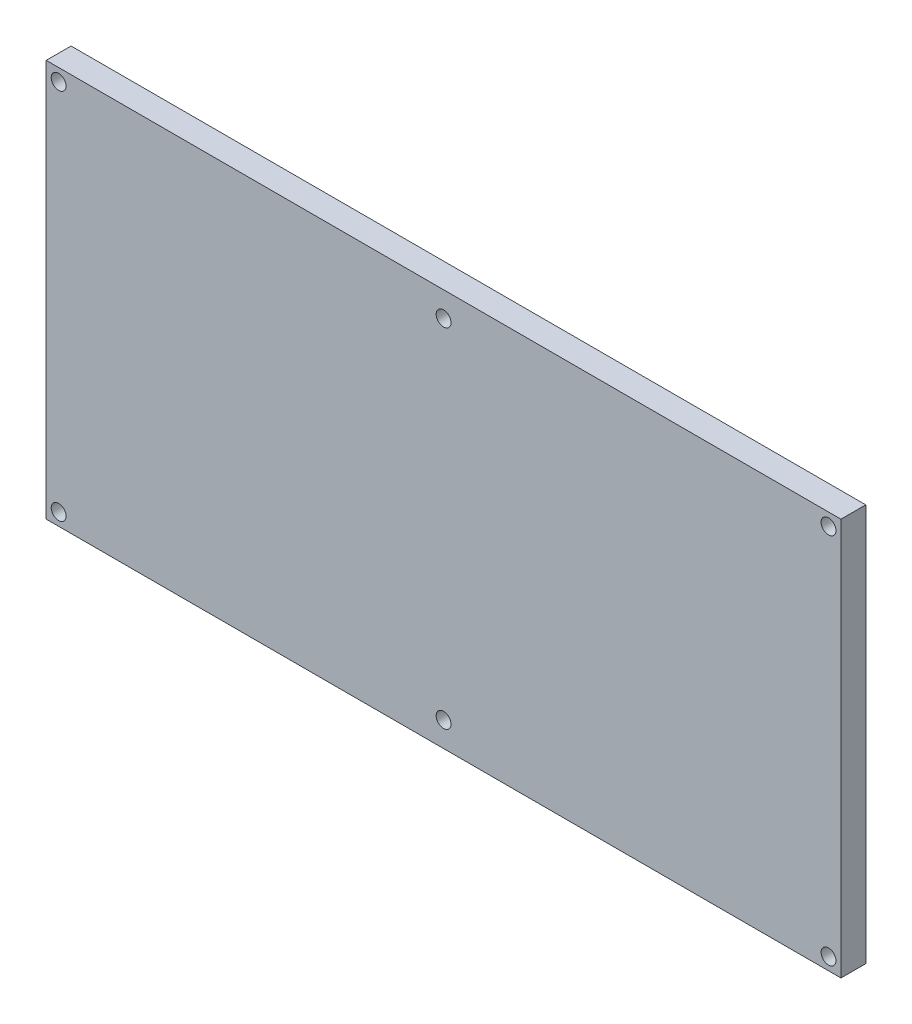
ISO-10303-21;
HEADER;
FILE_DESCRIPTION(('STEP AP214'),'2;1');
FILE_NAME('part.step','',(''),(''),'','','');
FILE_SCHEMA(('AUTOMOTIVE_DESIGN { 1 0 10303 214 1 1 1 1 }'));
ENDSEC;
DATA;
#1=APPLICATION_CONTEXT('core data for automotive mechanical design processes');
#2=APPLICATION_PROTOCOL_DEFINITION('international standard','automotive_design',2000,#1);
#3=PRODUCT_CONTEXT('',#1,'mechanical');
#4=PRODUCT('Part','Part','',(#3));
#5=PRODUCT_RELATED_PRODUCT_CATEGORY('part','',(#4));
#6=PRODUCT_DEFINITION_FORMATION('','',#4);
#7=PRODUCT_DEFINITION_CONTEXT('part definition',#1,'design');
#8=PRODUCT_DEFINITION('design','',#6,#7);
#9=PRODUCT_DEFINITION_SHAPE('','',#8);
#10=(LENGTH_UNIT() NAMED_UNIT(*) SI_UNIT(.MILLI.,.METRE.));
#11=(NAMED_UNIT(*) PLANE_ANGLE_UNIT() SI_UNIT($,.RADIAN.));
#12=(NAMED_UNIT(*) SI_UNIT($,.STERADIAN.) SOLID_ANGLE_UNIT());
#13=UNCERTAINTY_MEASURE_WITH_UNIT(LENGTH_MEASURE(1.E-05),#10,'distance_accuracy_value','');
#14=(GEOMETRIC_REPRESENTATION_CONTEXT(3) GLOBAL_UNCERTAINTY_ASSIGNED_CONTEXT((#13)) GLOBAL_UNIT_ASSIGNED_CONTEXT((#10,
#11,#12)) REPRESENTATION_CONTEXT('',''));
#15=CARTESIAN_POINT('',(0.,0.,0.));
#16=DIRECTION('',(0.,0.,1.));
#17=DIRECTION('',(1.,0.,0.));
#18=AXIS2_PLACEMENT_3D('',#15,#16,#17);
#19=CARTESIAN_POINT('',(0.,0.,6.35));
#20=DIRECTION('',(1.,0.,0.));
#21=DIRECTION('',(0.,0.,-1.));
#22=AXIS2_PLACEMENT_3D('',#19,#20,#21);
#23=PLANE('',#22);
#24=DIRECTION('',(0.,-1.,0.));
#25=VECTOR('',#24,1.);
#26=CARTESIAN_POINT('',(0.,0.,0.));
#27=LINE('',#26,#25);
#28=CARTESIAN_POINT('',(0.,101.6,0.));
#29=VERTEX_POINT('',#28);
#30=CARTESIAN_POINT('',(0.,0.,0.));
#31=VERTEX_POINT('',#30);
#32=EDGE_CURVE('E96',#29,#31,#27,.T.);
#33=ORIENTED_EDGE('',*,*,#32,.T.);
#34=DIRECTION('',(0.,0.,-1.));
#35=VECTOR('',#34,1.);
#36=CARTESIAN_POINT('',(0.,0.,6.35));
#37=LINE('',#36,#35);
#38=CARTESIAN_POINT('',(0.,0.,6.35));
#39=VERTEX_POINT('',#38);
#40=EDGE_CURVE('E11',#39,#31,#37,.T.);
#41=ORIENTED_EDGE('',*,*,#40,.F.);
#42=DIRECTION('',(0.,-1.,0.));
#43=VECTOR('',#42,1.);
#44=CARTESIAN_POINT('',(0.,0.,6.35));
#45=LINE('',#44,#43);
#46=CARTESIAN_POINT('',(0.,101.6,6.35));
#47=VERTEX_POINT('',#46);
#48=EDGE_CURVE('E84',#47,#39,#45,.T.);
#49=ORIENTED_EDGE('',*,*,#48,.F.);
#50=DIRECTION('',(0.,0.,-1.));
#51=VECTOR('',#50,1.);
#52=CARTESIAN_POINT('',(0.,101.6,6.35));
#53=LINE('',#52,#51);
#54=EDGE_CURVE('E92',#47,#29,#53,.T.);
#55=ORIENTED_EDGE('',*,*,#54,.T.);
#56=EDGE_LOOP('',(#33,#41,#49,#55));
#57=FACE_BOUND('',#56,.T.);
#58=ADVANCED_FACE('F33',(#57),#23,.F.);
#59=CARTESIAN_POINT('',(0.,0.,6.35));
#60=DIRECTION('',(0.,1.,0.));
#61=DIRECTION('',(0.,0.,1.));
#62=AXIS2_PLACEMENT_3D('',#59,#60,#61);
#63=PLANE('',#62);
#64=DIRECTION('',(1.,0.,0.));
#65=VECTOR('',#64,1.);
#66=CARTESIAN_POINT('',(0.,0.,0.));
#67=LINE('',#66,#65);
#68=CARTESIAN_POINT('',(203.2,0.,0.));
#69=VERTEX_POINT('',#68);
#70=EDGE_CURVE('E88',#31,#69,#67,.T.);
#71=ORIENTED_EDGE('',*,*,#70,.T.);
#72=DIRECTION('',(0.,0.,-1.));
#73=VECTOR('',#72,1.);
#74=CARTESIAN_POINT('',(203.2,0.,6.35));
#75=LINE('',#74,#73);
#76=CARTESIAN_POINT('',(203.2,0.,6.35));
#77=VERTEX_POINT('',#76);
#78=EDGE_CURVE('E41',#77,#69,#75,.T.);
#79=ORIENTED_EDGE('',*,*,#78,.F.);
#80=DIRECTION('',(1.,0.,0.));
#81=VECTOR('',#80,1.);
#82=CARTESIAN_POINT('',(0.,0.,6.35));
#83=LINE('',#82,#81);
#84=EDGE_CURVE('E79',#39,#77,#83,.T.);
#85=ORIENTED_EDGE('',*,*,#84,.F.);
#86=ORIENTED_EDGE('',*,*,#40,.T.);
#87=EDGE_LOOP('',(#71,#79,#85,#86));
#88=FACE_BOUND('',#87,.T.);
#89=ADVANCED_FACE('F87',(#88),#63,.F.);
#90=CARTESIAN_POINT('',(203.2,0.,6.35));
#91=DIRECTION('',(-1.,0.,0.));
#92=DIRECTION('',(0.,0.,1.));
#93=AXIS2_PLACEMENT_3D('',#90,#91,#92);
#94=PLANE('',#93);
#95=DIRECTION('',(0.,1.,0.));
#96=VECTOR('',#95,1.);
#97=CARTESIAN_POINT('',(203.2,0.,0.));
#98=LINE('',#97,#96);
#99=CARTESIAN_POINT('',(203.2,101.6,0.));
#100=VERTEX_POINT('',#99);
#101=EDGE_CURVE('E66',#69,#100,#98,.T.);
#102=ORIENTED_EDGE('',*,*,#101,.T.);
#103=DIRECTION('',(0.,0.,-1.));
#104=VECTOR('',#103,1.);
#105=CARTESIAN_POINT('',(203.2,101.6,6.35));
#106=LINE('',#105,#104);
#107=CARTESIAN_POINT('',(203.2,101.6,6.35));
#108=VERTEX_POINT('',#107);
#109=EDGE_CURVE('E89',#108,#100,#106,.T.);
#110=ORIENTED_EDGE('',*,*,#109,.F.);
#111=DIRECTION('',(0.,1.,0.));
#112=VECTOR('',#111,1.);
#113=CARTESIAN_POINT('',(203.2,0.,6.35));
#114=LINE('',#113,#112);
#115=EDGE_CURVE('E82',#77,#108,#114,.T.);
#116=ORIENTED_EDGE('',*,*,#115,.F.);
#117=ORIENTED_EDGE('',*,*,#78,.T.);
#118=EDGE_LOOP('',(#102,#110,#116,#117));
#119=FACE_BOUND('',#118,.T.);
#120=ADVANCED_FACE('F90',(#119),#94,.F.);
#121=CARTESIAN_POINT('',(0.,101.6,6.35));
#122=DIRECTION('',(0.,-1.,0.));
#123=DIRECTION('',(0.,0.,-1.));
#124=AXIS2_PLACEMENT_3D('',#121,#122,#123);
#125=PLANE('',#124);
#126=DIRECTION('',(-1.,0.,0.));
#127=VECTOR('',#126,1.);
#128=CARTESIAN_POINT('',(0.,101.6,0.));
#129=LINE('',#128,#127);
#130=EDGE_CURVE('E72',#100,#29,#129,.T.);
#131=ORIENTED_EDGE('',*,*,#130,.T.);
#132=ORIENTED_EDGE('',*,*,#54,.F.);
#133=DIRECTION('',(-1.,0.,0.));
#134=VECTOR('',#133,1.);
#135=CARTESIAN_POINT('',(0.,101.6,6.35));
#136=LINE('',#135,#134);
#137=EDGE_CURVE('E49',#108,#47,#136,.T.);
#138=ORIENTED_EDGE('',*,*,#137,.F.);
#139=ORIENTED_EDGE('',*,*,#109,.T.);
#140=EDGE_LOOP('',(#131,#132,#138,#139));
#141=FACE_BOUND('',#140,.T.);
#142=ADVANCED_FACE('F104',(#141),#125,.F.);
#143=CARTESIAN_POINT('',(0.,0.,6.35));
#144=DIRECTION('',(0.,0.,-1.));
#145=DIRECTION('',(-1.,0.,0.));
#146=AXIS2_PLACEMENT_3D('',#143,#144,#145);
#147=PLANE('',#146);
#148=CARTESIAN_POINT('',(3.175,3.175,6.35));
#149=DIRECTION('',(0.,0.,1.));
#150=DIRECTION('',(1.,0.,0.));
#151=AXIS2_PLACEMENT_3D('',#148,#149,#150);
#152=CIRCLE('',#151,1.89864999999999);
#153=CARTESIAN_POINT('',(5.07364999999999,3.175,6.35));
#154=VERTEX_POINT('',#153);
#155=EDGE_CURVE('E142',#154,#154,#152,.T.);
#156=ORIENTED_EDGE('',*,*,#155,.F.);
#157=EDGE_LOOP('',(#156));
#158=FACE_BOUND('',#157,.T.);
#159=CARTESIAN_POINT('',(3.17500000000001,98.425,6.35));
#160=DIRECTION('',(0.,0.,1.));
#161=DIRECTION('',(1.,0.,0.));
#162=AXIS2_PLACEMENT_3D('',#159,#160,#161);
#163=CIRCLE('',#162,1.89864999999999);
#164=CARTESIAN_POINT('',(5.07365,98.425,6.35));
#165=VERTEX_POINT('',#164);
#166=EDGE_CURVE('E136',#165,#165,#163,.T.);
#167=ORIENTED_EDGE('',*,*,#166,.F.);
#168=EDGE_LOOP('',(#167));
#169=FACE_BOUND('',#168,.T.);
#170=CARTESIAN_POINT('',(200.025,98.425,6.35));
#171=DIRECTION('',(0.,0.,1.));
#172=DIRECTION('',(1.,0.,0.));
#173=AXIS2_PLACEMENT_3D('',#170,#171,#172);
#174=CIRCLE('',#173,1.89864999999997);
#175=CARTESIAN_POINT('',(201.92365,98.425,6.35));
#176=VERTEX_POINT('',#175);
#177=EDGE_CURVE('E130',#176,#176,#174,.T.);
#178=ORIENTED_EDGE('',*,*,#177,.F.);
#179=EDGE_LOOP('',(#178));
#180=FACE_BOUND('',#179,.T.);
#181=CARTESIAN_POINT('',(200.025,3.17500000000002,6.35));
#182=DIRECTION('',(0.,0.,1.));
#183=DIRECTION('',(1.,0.,0.));
#184=AXIS2_PLACEMENT_3D('',#181,#182,#183);
#185=CIRCLE('',#184,1.89865);
#186=CARTESIAN_POINT('',(201.92365,3.17500000000002,6.35));
#187=VERTEX_POINT('',#186);
#188=EDGE_CURVE('E124',#187,#187,#185,.T.);
#189=ORIENTED_EDGE('',*,*,#188,.F.);
#190=EDGE_LOOP('',(#189));
#191=FACE_BOUND('',#190,.T.);
#192=CARTESIAN_POINT('',(101.6,95.25,6.35));
#193=DIRECTION('',(0.,0.,1.));
#194=DIRECTION('',(1.,0.,0.));
#195=AXIS2_PLACEMENT_3D('',#192,#193,#194);
#196=CIRCLE('',#195,1.89864999999999);
#197=CARTESIAN_POINT('',(103.49865,95.25,6.35));
#198=VERTEX_POINT('',#197);
#199=EDGE_CURVE('E118',#198,#198,#196,.T.);
#200=ORIENTED_EDGE('',*,*,#199,.F.);
#201=EDGE_LOOP('',(#200));
#202=FACE_BOUND('',#201,.T.);
#203=CARTESIAN_POINT('',(101.6,6.35,6.35));
#204=DIRECTION('',(0.,0.,1.));
#205=DIRECTION('',(1.,0.,0.));
#206=AXIS2_PLACEMENT_3D('',#203,#204,#205);
#207=CIRCLE('',#206,1.89864999999999);
#208=CARTESIAN_POINT('',(103.49865,6.35,6.35));
#209=VERTEX_POINT('',#208);
#210=EDGE_CURVE('E112',#209,#209,#207,.T.);
#211=ORIENTED_EDGE('',*,*,#210,.F.);
#212=EDGE_LOOP('',(#211));
#213=FACE_BOUND('',#212,.T.);
#214=ORIENTED_EDGE('',*,*,#48,.T.);
#215=ORIENTED_EDGE('',*,*,#84,.T.);
#216=ORIENTED_EDGE('',*,*,#115,.T.);
#217=ORIENTED_EDGE('',*,*,#137,.T.);
#218=EDGE_LOOP('',(#214,#215,#216,#217));
#219=FACE_BOUND('',#218,.T.);
#220=ADVANCED_FACE('F80',(#158,#169,#180,#191,#202,#213,#219),#147,.F.);
#221=CARTESIAN_POINT('',(0.,0.,0.));
#222=DIRECTION('',(0.,0.,-1.));
#223=DIRECTION('',(-1.,0.,0.));
#224=AXIS2_PLACEMENT_3D('',#221,#222,#223);
#225=PLANE('',#224);
#226=CARTESIAN_POINT('',(3.175,3.175,0.));
#227=DIRECTION('',(0.,0.,1.));
#228=DIRECTION('',(1.,0.,0.));
#229=AXIS2_PLACEMENT_3D('',#226,#227,#228);
#230=CIRCLE('',#229,1.89865);
#231=CARTESIAN_POINT('',(5.07365,3.175,0.));
#232=VERTEX_POINT('',#231);
#233=EDGE_CURVE('E139',#232,#232,#230,.T.);
#234=ORIENTED_EDGE('',*,*,#233,.T.);
#235=EDGE_LOOP('',(#234));
#236=FACE_BOUND('',#235,.T.);
#237=CARTESIAN_POINT('',(3.17500000000001,98.425,0.));
#238=DIRECTION('',(0.,0.,1.));
#239=DIRECTION('',(1.,0.,0.));
#240=AXIS2_PLACEMENT_3D('',#237,#238,#239);
#241=CIRCLE('',#240,1.89865);
#242=CARTESIAN_POINT('',(5.07365000000001,98.425,0.));
#243=VERTEX_POINT('',#242);
#244=EDGE_CURVE('E133',#243,#243,#241,.T.);
#245=ORIENTED_EDGE('',*,*,#244,.T.);
#246=EDGE_LOOP('',(#245));
#247=FACE_BOUND('',#246,.T.);
#248=CARTESIAN_POINT('',(200.025,98.425,0.));
#249=DIRECTION('',(0.,0.,1.));
#250=DIRECTION('',(1.,0.,0.));
#251=AXIS2_PLACEMENT_3D('',#248,#249,#250);
#252=CIRCLE('',#251,1.89865);
#253=CARTESIAN_POINT('',(201.92365,98.425,0.));
#254=VERTEX_POINT('',#253);
#255=EDGE_CURVE('E127',#254,#254,#252,.T.);
#256=ORIENTED_EDGE('',*,*,#255,.T.);
#257=EDGE_LOOP('',(#256));
#258=FACE_BOUND('',#257,.T.);
#259=CARTESIAN_POINT('',(200.025,3.17500000000002,0.));
#260=DIRECTION('',(0.,0.,1.));
#261=DIRECTION('',(1.,0.,0.));
#262=AXIS2_PLACEMENT_3D('',#259,#260,#261);
#263=CIRCLE('',#262,1.89865);
#264=CARTESIAN_POINT('',(201.92365,3.17500000000002,0.));
#265=VERTEX_POINT('',#264);
#266=EDGE_CURVE('E121',#265,#265,#263,.T.);
#267=ORIENTED_EDGE('',*,*,#266,.T.);
#268=EDGE_LOOP('',(#267));
#269=FACE_BOUND('',#268,.T.);
#270=CARTESIAN_POINT('',(101.6,95.25,0.));
#271=DIRECTION('',(0.,0.,1.));
#272=DIRECTION('',(1.,0.,0.));
#273=AXIS2_PLACEMENT_3D('',#270,#271,#272);
#274=CIRCLE('',#273,1.89865);
#275=CARTESIAN_POINT('',(103.49865,95.25,0.));
#276=VERTEX_POINT('',#275);
#277=EDGE_CURVE('E115',#276,#276,#274,.T.);
#278=ORIENTED_EDGE('',*,*,#277,.T.);
#279=EDGE_LOOP('',(#278));
#280=FACE_BOUND('',#279,.T.);
#281=CARTESIAN_POINT('',(101.6,6.35,0.));
#282=DIRECTION('',(0.,0.,1.));
#283=DIRECTION('',(1.,0.,0.));
#284=AXIS2_PLACEMENT_3D('',#281,#282,#283);
#285=CIRCLE('',#284,1.89865);
#286=CARTESIAN_POINT('',(103.49865,6.35,0.));
#287=VERTEX_POINT('',#286);
#288=EDGE_CURVE('E99',#287,#287,#285,.T.);
#289=ORIENTED_EDGE('',*,*,#288,.T.);
#290=EDGE_LOOP('',(#289));
#291=FACE_BOUND('',#290,.T.);
#292=ORIENTED_EDGE('',*,*,#32,.F.);
#293=ORIENTED_EDGE('',*,*,#130,.F.);
#294=ORIENTED_EDGE('',*,*,#101,.F.);
#295=ORIENTED_EDGE('',*,*,#70,.F.);
#296=EDGE_LOOP('',(#292,#293,#294,#295));
#297=FACE_BOUND('',#296,.T.);
#298=ADVANCED_FACE('F107',(#236,#247,#258,#269,#280,#291,#297),#225,.T.);
#299=CARTESIAN_POINT('',(101.6,6.35,6.35));
#300=DIRECTION('',(0.,0.,1.));
#301=DIRECTION('',(1.,0.,0.));
#302=AXIS2_PLACEMENT_3D('',#299,#300,#301);
#303=CYLINDRICAL_SURFACE('',#302,1.89864999999999);
#304=ORIENTED_EDGE('',*,*,#288,.F.);
#305=EDGE_LOOP('',(#304));
#306=FACE_BOUND('',#305,.T.);
#307=ORIENTED_EDGE('',*,*,#210,.T.);
#308=EDGE_LOOP('',(#307));
#309=FACE_BOUND('',#308,.T.);
#310=ADVANCED_FACE('F161',(#306,#309),#303,.F.);
#311=CARTESIAN_POINT('',(101.6,95.25,6.35));
#312=DIRECTION('',(0.,0.,1.));
#313=DIRECTION('',(1.,0.,0.));
#314=AXIS2_PLACEMENT_3D('',#311,#312,#313);
#315=CYLINDRICAL_SURFACE('',#314,1.89864999999999);
#316=ORIENTED_EDGE('',*,*,#277,.F.);
#317=EDGE_LOOP('',(#316));
#318=FACE_BOUND('',#317,.T.);
#319=ORIENTED_EDGE('',*,*,#199,.T.);
#320=EDGE_LOOP('',(#319));
#321=FACE_BOUND('',#320,.T.);
#322=ADVANCED_FACE('F163',(#318,#321),#315,.F.);
#323=CARTESIAN_POINT('',(200.025,3.17500000000002,6.35));
#324=DIRECTION('',(0.,0.,1.));
#325=DIRECTION('',(1.,0.,0.));
#326=AXIS2_PLACEMENT_3D('',#323,#324,#325);
#327=CYLINDRICAL_SURFACE('',#326,1.89865);
#328=ORIENTED_EDGE('',*,*,#266,.F.);
#329=EDGE_LOOP('',(#328));
#330=FACE_BOUND('',#329,.T.);
#331=ORIENTED_EDGE('',*,*,#188,.T.);
#332=EDGE_LOOP('',(#331));
#333=FACE_BOUND('',#332,.T.);
#334=ADVANCED_FACE('F170',(#330,#333),#327,.F.);
#335=CARTESIAN_POINT('',(200.025,98.425,6.35));
#336=DIRECTION('',(0.,0.,1.));
#337=DIRECTION('',(1.,0.,0.));
#338=AXIS2_PLACEMENT_3D('',#335,#336,#337);
#339=CYLINDRICAL_SURFACE('',#338,1.89864999999999);
#340=ORIENTED_EDGE('',*,*,#255,.F.);
#341=EDGE_LOOP('',(#340));
#342=FACE_BOUND('',#341,.T.);
#343=ORIENTED_EDGE('',*,*,#177,.T.);
#344=EDGE_LOOP('',(#343));
#345=FACE_BOUND('',#344,.T.);
#346=ADVANCED_FACE('F217',(#342,#345),#339,.F.);
#347=CARTESIAN_POINT('',(3.17500000000001,98.425,6.35));
#348=DIRECTION('',(0.,0.,1.));
#349=DIRECTION('',(1.,0.,0.));
#350=AXIS2_PLACEMENT_3D('',#347,#348,#349);
#351=CYLINDRICAL_SURFACE('',#350,1.89864999999999);
#352=ORIENTED_EDGE('',*,*,#244,.F.);
#353=EDGE_LOOP('',(#352));
#354=FACE_BOUND('',#353,.T.);
#355=ORIENTED_EDGE('',*,*,#166,.T.);
#356=EDGE_LOOP('',(#355));
#357=FACE_BOUND('',#356,.T.);
#358=ADVANCED_FACE('F227',(#354,#357),#351,.F.);
#359=CARTESIAN_POINT('',(3.175,3.175,6.35));
#360=DIRECTION('',(0.,0.,1.));
#361=DIRECTION('',(1.,0.,0.));
#362=AXIS2_PLACEMENT_3D('',#359,#360,#361);
#363=CYLINDRICAL_SURFACE('',#362,1.89864999999999);
#364=ORIENTED_EDGE('',*,*,#233,.F.);
#365=EDGE_LOOP('',(#364));
#366=FACE_BOUND('',#365,.T.);
#367=ORIENTED_EDGE('',*,*,#155,.T.);
#368=EDGE_LOOP('',(#367));
#369=FACE_BOUND('',#368,.T.);
#370=ADVANCED_FACE('F146',(#366,#369),#363,.F.);
#371=CLOSED_SHELL('',(#58,#89,#120,#142,#220,#298,#310,#322,#334,#346,#358,#370));
#372=MANIFOLD_SOLID_BREP('B2',#371);
#373=ADVANCED_BREP_SHAPE_REPRESENTATION('',(#18,#372),#14);
#374=SHAPE_DEFINITION_REPRESENTATION(#9,#373);
ENDSEC;
END-ISO-10303-21;
